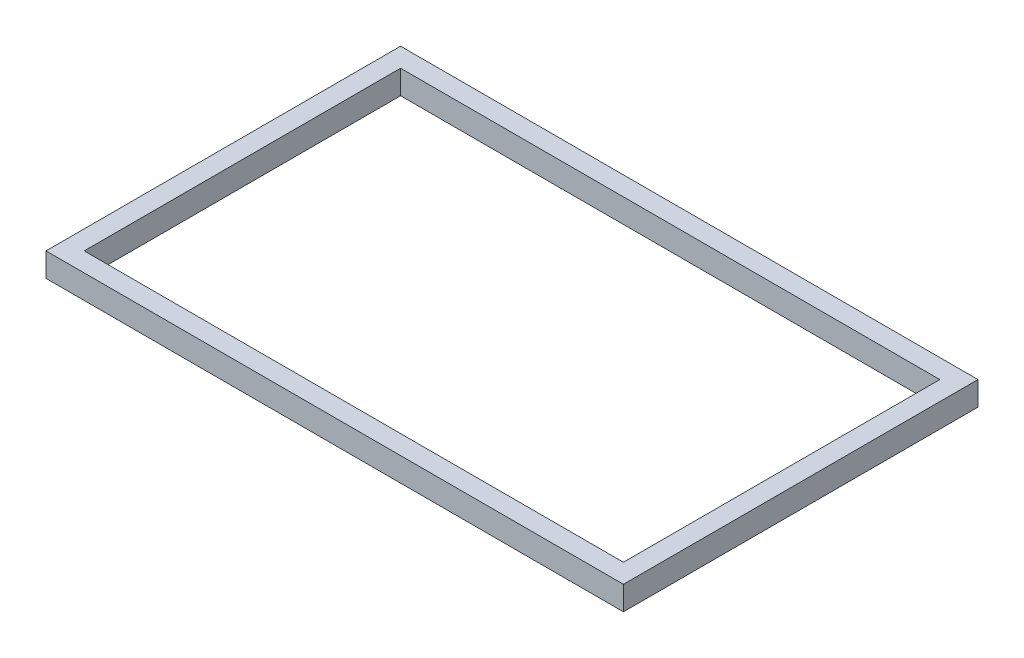
ISO-10303-21;
HEADER;
FILE_DESCRIPTION(('STEP AP214'),'2;1');
FILE_NAME('part.step','',(''),(''),'','','');
FILE_SCHEMA(('AUTOMOTIVE_DESIGN { 1 0 10303 214 1 1 1 1 }'));
ENDSEC;
DATA;
#1=APPLICATION_CONTEXT('core data for automotive mechanical design processes');
#2=APPLICATION_PROTOCOL_DEFINITION('international standard','automotive_design',2000,#1);
#3=PRODUCT_CONTEXT('',#1,'mechanical');
#4=PRODUCT('Part','Part','',(#3));
#5=PRODUCT_RELATED_PRODUCT_CATEGORY('part','',(#4));
#6=PRODUCT_DEFINITION_FORMATION('','',#4);
#7=PRODUCT_DEFINITION_CONTEXT('part definition',#1,'design');
#8=PRODUCT_DEFINITION('design','',#6,#7);
#9=PRODUCT_DEFINITION_SHAPE('','',#8);
#10=(LENGTH_UNIT() NAMED_UNIT(*) SI_UNIT(.MILLI.,.METRE.));
#11=(NAMED_UNIT(*) PLANE_ANGLE_UNIT() SI_UNIT($,.RADIAN.));
#12=(NAMED_UNIT(*) SI_UNIT($,.STERADIAN.) SOLID_ANGLE_UNIT());
#13=UNCERTAINTY_MEASURE_WITH_UNIT(LENGTH_MEASURE(1.E-05),#10,'distance_accuracy_value','');
#14=(GEOMETRIC_REPRESENTATION_CONTEXT(3) GLOBAL_UNCERTAINTY_ASSIGNED_CONTEXT((#13)) GLOBAL_UNIT_ASSIGNED_CONTEXT((#10,
#11,#12)) REPRESENTATION_CONTEXT('',''));
#15=CARTESIAN_POINT('',(0.,0.,0.));
#16=DIRECTION('',(0.,0.,1.));
#17=DIRECTION('',(1.,0.,0.));
#18=AXIS2_PLACEMENT_3D('',#15,#16,#17);
#19=CARTESIAN_POINT('',(-21.7906654675505,10.,45.635438217786));
#20=DIRECTION('',(0.,0.,1.));
#21=DIRECTION('',(1.,0.,0.));
#22=AXIS2_PLACEMENT_3D('',#19,#20,#21);
#23=PLANE('',#22);
#24=DIRECTION('',(-1.,0.,0.));
#25=VECTOR('',#24,1.);
#26=CARTESIAN_POINT('',(-21.7906654675505,2.5,45.635438217786));
#27=LINE('',#26,#25);
#28=CARTESIAN_POINT('',(34.7093345324495,2.5,45.635438217786));
#29=VERTEX_POINT('',#28);
#30=CARTESIAN_POINT('',(-21.7906654675505,2.5,45.635438217786));
#31=VERTEX_POINT('',#30);
#32=EDGE_CURVE('E143',#29,#31,#27,.T.);
#33=ORIENTED_EDGE('',*,*,#32,.F.);
#34=DIRECTION('',(0.,-1.,0.));
#35=VECTOR('',#34,1.);
#36=CARTESIAN_POINT('',(34.7093345324495,10.,45.635438217786));
#37=LINE('',#36,#35);
#38=CARTESIAN_POINT('',(34.7093345324495,0.,45.635438217786));
#39=VERTEX_POINT('',#38);
#40=EDGE_CURVE('E160',#29,#39,#37,.T.);
#41=ORIENTED_EDGE('',*,*,#40,.T.);
#42=DIRECTION('',(-1.,0.,0.));
#43=VECTOR('',#42,1.);
#44=CARTESIAN_POINT('',(-21.7906654675505,0.,45.635438217786));
#45=LINE('',#44,#43);
#46=CARTESIAN_POINT('',(-21.7906654675505,0.,45.635438217786));
#47=VERTEX_POINT('',#46);
#48=EDGE_CURVE('E155',#39,#47,#45,.T.);
#49=ORIENTED_EDGE('',*,*,#48,.T.);
#50=DIRECTION('',(0.,-1.,0.));
#51=VECTOR('',#50,1.);
#52=CARTESIAN_POINT('',(-21.7906654675505,10.,45.635438217786));
#53=LINE('',#52,#51);
#54=EDGE_CURVE('E48',#31,#47,#53,.T.);
#55=ORIENTED_EDGE('',*,*,#54,.F.);
#56=EDGE_LOOP('',(#33,#41,#49,#55));
#57=FACE_BOUND('',#56,.T.);
#58=ADVANCED_FACE('F40',(#57),#23,.F.);
#59=CARTESIAN_POINT('',(34.7093345324495,10.,45.635438217786));
#60=DIRECTION('',(1.,0.,0.));
#61=DIRECTION('',(0.,0.,-1.));
#62=AXIS2_PLACEMENT_3D('',#59,#60,#61);
#63=PLANE('',#62);
#64=DIRECTION('',(0.,0.,1.));
#65=VECTOR('',#64,1.);
#66=CARTESIAN_POINT('',(34.7093345324495,2.5,45.635438217786));
#67=LINE('',#66,#65);
#68=CARTESIAN_POINT('',(34.7093345324495,2.5,12.485438217786));
#69=VERTEX_POINT('',#68);
#70=EDGE_CURVE('E141',#69,#29,#67,.T.);
#71=ORIENTED_EDGE('',*,*,#70,.F.);
#72=DIRECTION('',(0.,-1.,0.));
#73=VECTOR('',#72,1.);
#74=CARTESIAN_POINT('',(34.7093345324495,10.,12.485438217786));
#75=LINE('',#74,#73);
#76=CARTESIAN_POINT('',(34.7093345324495,0.,12.485438217786));
#77=VERTEX_POINT('',#76);
#78=EDGE_CURVE('E162',#69,#77,#75,.T.);
#79=ORIENTED_EDGE('',*,*,#78,.T.);
#80=DIRECTION('',(0.,0.,1.));
#81=VECTOR('',#80,1.);
#82=CARTESIAN_POINT('',(34.7093345324495,0.,45.635438217786));
#83=LINE('',#82,#81);
#84=EDGE_CURVE('E152',#77,#39,#83,.T.);
#85=ORIENTED_EDGE('',*,*,#84,.T.);
#86=ORIENTED_EDGE('',*,*,#40,.F.);
#87=EDGE_LOOP('',(#71,#79,#85,#86));
#88=FACE_BOUND('',#87,.T.);
#89=ADVANCED_FACE('F178',(#88),#63,.F.);
#90=CARTESIAN_POINT('',(-21.7906654675505,10.,12.485438217786));
#91=DIRECTION('',(0.,0.,-1.));
#92=DIRECTION('',(-1.,0.,0.));
#93=AXIS2_PLACEMENT_3D('',#90,#91,#92);
#94=PLANE('',#93);
#95=DIRECTION('',(1.,0.,0.));
#96=VECTOR('',#95,1.);
#97=CARTESIAN_POINT('',(-21.7906654675505,2.5,12.485438217786));
#98=LINE('',#97,#96);
#99=CARTESIAN_POINT('',(-21.7906654675505,2.5,12.485438217786));
#100=VERTEX_POINT('',#99);
#101=EDGE_CURVE('E12',#100,#69,#98,.T.);
#102=ORIENTED_EDGE('',*,*,#101,.F.);
#103=DIRECTION('',(0.,-1.,0.));
#104=VECTOR('',#103,1.);
#105=CARTESIAN_POINT('',(-21.7906654675505,10.,12.485438217786));
#106=LINE('',#105,#104);
#107=CARTESIAN_POINT('',(-21.7906654675505,0.,12.485438217786));
#108=VERTEX_POINT('',#107);
#109=EDGE_CURVE('E158',#100,#108,#106,.T.);
#110=ORIENTED_EDGE('',*,*,#109,.T.);
#111=DIRECTION('',(1.,0.,0.));
#112=VECTOR('',#111,1.);
#113=CARTESIAN_POINT('',(-21.7906654675505,0.,12.485438217786));
#114=LINE('',#113,#112);
#115=EDGE_CURVE('E149',#108,#77,#114,.T.);
#116=ORIENTED_EDGE('',*,*,#115,.T.);
#117=ORIENTED_EDGE('',*,*,#78,.F.);
#118=EDGE_LOOP('',(#102,#110,#116,#117));
#119=FACE_BOUND('',#118,.T.);
#120=ADVANCED_FACE('F165',(#119),#94,.F.);
#121=CARTESIAN_POINT('',(40.,0.,-12.5));
#122=DIRECTION('',(0.,1.,0.));
#123=DIRECTION('',(0.,0.,1.));
#124=AXIS2_PLACEMENT_3D('',#121,#122,#123);
#125=PLANE('',#124);
#126=ORIENTED_EDGE('',*,*,#115,.F.);
#127=DIRECTION('',(0.,0.,-1.));
#128=VECTOR('',#127,1.);
#129=CARTESIAN_POINT('',(-21.7906654675505,0.,45.635438217786));
#130=LINE('',#129,#128);
#131=EDGE_CURVE('E146',#47,#108,#130,.T.);
#132=ORIENTED_EDGE('',*,*,#131,.F.);
#133=ORIENTED_EDGE('',*,*,#48,.F.);
#134=ORIENTED_EDGE('',*,*,#84,.F.);
#135=EDGE_LOOP('',(#126,#132,#133,#134));
#136=FACE_BOUND('',#135,.T.);
#137=DIRECTION('',(0.,0.,1.));
#138=VECTOR('',#137,1.);
#139=CARTESIAN_POINT('',(-23.7906654675505,0.,-12.5));
#140=LINE('',#139,#138);
#141=CARTESIAN_POINT('',(-23.7906654675505,0.,10.485438217786));
#142=VERTEX_POINT('',#141);
#143=CARTESIAN_POINT('',(-23.7906654675505,0.,47.635438217786));
#144=VERTEX_POINT('',#143);
#145=EDGE_CURVE('E115',#142,#144,#140,.T.);
#146=ORIENTED_EDGE('',*,*,#145,.F.);
#147=DIRECTION('',(-1.,0.,0.));
#148=VECTOR('',#147,1.);
#149=CARTESIAN_POINT('',(40.,0.,10.485438217786));
#150=LINE('',#149,#148);
#151=CARTESIAN_POINT('',(36.7093345324495,0.,10.485438217786));
#152=VERTEX_POINT('',#151);
#153=EDGE_CURVE('E121',#152,#142,#150,.T.);
#154=ORIENTED_EDGE('',*,*,#153,.F.);
#155=DIRECTION('',(0.,0.,-1.));
#156=VECTOR('',#155,1.);
#157=CARTESIAN_POINT('',(36.7093345324495,0.,-12.5));
#158=LINE('',#157,#156);
#159=CARTESIAN_POINT('',(36.7093345324495,0.,47.635438217786));
#160=VERTEX_POINT('',#159);
#161=EDGE_CURVE('E105',#160,#152,#158,.T.);
#162=ORIENTED_EDGE('',*,*,#161,.F.);
#163=DIRECTION('',(1.,0.,0.));
#164=VECTOR('',#163,1.);
#165=CARTESIAN_POINT('',(40.,0.,47.635438217786));
#166=LINE('',#165,#164);
#167=EDGE_CURVE('E128',#144,#160,#166,.T.);
#168=ORIENTED_EDGE('',*,*,#167,.F.);
#169=EDGE_LOOP('',(#146,#154,#162,#168));
#170=FACE_BOUND('',#169,.T.);
#171=ADVANCED_FACE('F42',(#136,#170),#125,.F.);
#172=CARTESIAN_POINT('',(-21.7906654675505,10.,45.635438217786));
#173=DIRECTION('',(-1.,0.,0.));
#174=DIRECTION('',(0.,0.,1.));
#175=AXIS2_PLACEMENT_3D('',#172,#173,#174);
#176=PLANE('',#175);
#177=DIRECTION('',(0.,0.,-1.));
#178=VECTOR('',#177,1.);
#179=CARTESIAN_POINT('',(-21.7906654675505,2.5,45.635438217786));
#180=LINE('',#179,#178);
#181=EDGE_CURVE('E62',#31,#100,#180,.T.);
#182=ORIENTED_EDGE('',*,*,#181,.F.);
#183=ORIENTED_EDGE('',*,*,#54,.T.);
#184=ORIENTED_EDGE('',*,*,#131,.T.);
#185=ORIENTED_EDGE('',*,*,#109,.F.);
#186=EDGE_LOOP('',(#182,#183,#184,#185));
#187=FACE_BOUND('',#186,.T.);
#188=ADVANCED_FACE('F171',(#187),#176,.F.);
#189=CARTESIAN_POINT('',(0.,2.5,0.));
#190=DIRECTION('',(0.,1.,0.));
#191=DIRECTION('',(0.,0.,1.));
#192=AXIS2_PLACEMENT_3D('',#189,#190,#191);
#193=PLANE('',#192);
#194=DIRECTION('',(0.,0.,1.));
#195=VECTOR('',#194,1.);
#196=CARTESIAN_POINT('',(-23.7906654675505,2.5,10.485438217786));
#197=LINE('',#196,#195);
#198=CARTESIAN_POINT('',(-23.7906654675505,2.5,10.485438217786));
#199=VERTEX_POINT('',#198);
#200=CARTESIAN_POINT('',(-23.7906654675505,2.5,47.635438217786));
#201=VERTEX_POINT('',#200);
#202=EDGE_CURVE('E127',#199,#201,#197,.T.);
#203=ORIENTED_EDGE('',*,*,#202,.T.);
#204=DIRECTION('',(1.,0.,0.));
#205=VECTOR('',#204,1.);
#206=CARTESIAN_POINT('',(-23.7906654675505,2.5,47.635438217786));
#207=LINE('',#206,#205);
#208=CARTESIAN_POINT('',(36.7093345324495,2.5,47.635438217786));
#209=VERTEX_POINT('',#208);
#210=EDGE_CURVE('E131',#201,#209,#207,.T.);
#211=ORIENTED_EDGE('',*,*,#210,.T.);
#212=DIRECTION('',(0.,0.,-1.));
#213=VECTOR('',#212,1.);
#214=CARTESIAN_POINT('',(36.7093345324495,2.5,10.485438217786));
#215=LINE('',#214,#213);
#216=CARTESIAN_POINT('',(36.7093345324495,2.5,10.485438217786));
#217=VERTEX_POINT('',#216);
#218=EDGE_CURVE('E138',#209,#217,#215,.T.);
#219=ORIENTED_EDGE('',*,*,#218,.T.);
#220=DIRECTION('',(-1.,0.,0.));
#221=VECTOR('',#220,1.);
#222=CARTESIAN_POINT('',(-23.7906654675505,2.5,10.485438217786));
#223=LINE('',#222,#221);
#224=EDGE_CURVE('E124',#217,#199,#223,.T.);
#225=ORIENTED_EDGE('',*,*,#224,.T.);
#226=EDGE_LOOP('',(#203,#211,#219,#225));
#227=FACE_BOUND('',#226,.T.);
#228=ORIENTED_EDGE('',*,*,#181,.T.);
#229=ORIENTED_EDGE('',*,*,#101,.T.);
#230=ORIENTED_EDGE('',*,*,#70,.T.);
#231=ORIENTED_EDGE('',*,*,#32,.T.);
#232=EDGE_LOOP('',(#228,#229,#230,#231));
#233=FACE_BOUND('',#232,.T.);
#234=ADVANCED_FACE('F180',(#227,#233),#193,.T.);
#235=CARTESIAN_POINT('',(-23.7906654675505,-2.,10.485438217786));
#236=DIRECTION('',(0.,0.,-1.));
#237=DIRECTION('',(-1.,0.,0.));
#238=AXIS2_PLACEMENT_3D('',#235,#236,#237);
#239=PLANE('',#238);
#240=ORIENTED_EDGE('',*,*,#153,.T.);
#241=DIRECTION('',(0.,1.,0.));
#242=VECTOR('',#241,1.);
#243=CARTESIAN_POINT('',(-23.7906654675505,-2.,10.485438217786));
#244=LINE('',#243,#242);
#245=EDGE_CURVE('E116',#142,#199,#244,.T.);
#246=ORIENTED_EDGE('',*,*,#245,.T.);
#247=ORIENTED_EDGE('',*,*,#224,.F.);
#248=DIRECTION('',(0.,1.,0.));
#249=VECTOR('',#248,1.);
#250=CARTESIAN_POINT('',(36.7093345324495,-2.,10.485438217786));
#251=LINE('',#250,#249);
#252=EDGE_CURVE('E109',#152,#217,#251,.T.);
#253=ORIENTED_EDGE('',*,*,#252,.F.);
#254=EDGE_LOOP('',(#240,#246,#247,#253));
#255=FACE_BOUND('',#254,.T.);
#256=ADVANCED_FACE('F119',(#255),#239,.T.);
#257=CARTESIAN_POINT('',(-23.7906654675505,-2.,47.635438217786));
#258=DIRECTION('',(0.,0.,1.));
#259=DIRECTION('',(1.,0.,0.));
#260=AXIS2_PLACEMENT_3D('',#257,#258,#259);
#261=PLANE('',#260);
#262=ORIENTED_EDGE('',*,*,#167,.T.);
#263=DIRECTION('',(0.,1.,0.));
#264=VECTOR('',#263,1.);
#265=CARTESIAN_POINT('',(36.7093345324495,-2.,47.635438217786));
#266=LINE('',#265,#264);
#267=EDGE_CURVE('E111',#160,#209,#266,.T.);
#268=ORIENTED_EDGE('',*,*,#267,.T.);
#269=ORIENTED_EDGE('',*,*,#210,.F.);
#270=DIRECTION('',(0.,1.,0.));
#271=VECTOR('',#270,1.);
#272=CARTESIAN_POINT('',(-23.7906654675505,-2.,47.635438217786));
#273=LINE('',#272,#271);
#274=EDGE_CURVE('E55',#144,#201,#273,.T.);
#275=ORIENTED_EDGE('',*,*,#274,.F.);
#276=EDGE_LOOP('',(#262,#268,#269,#275));
#277=FACE_BOUND('',#276,.T.);
#278=ADVANCED_FACE('F218',(#277),#261,.T.);
#279=CARTESIAN_POINT('',(-23.7906654675505,-2.,10.485438217786));
#280=DIRECTION('',(-1.,0.,0.));
#281=DIRECTION('',(0.,0.,1.));
#282=AXIS2_PLACEMENT_3D('',#279,#280,#281);
#283=PLANE('',#282);
#284=ORIENTED_EDGE('',*,*,#145,.T.);
#285=ORIENTED_EDGE('',*,*,#274,.T.);
#286=ORIENTED_EDGE('',*,*,#202,.F.);
#287=ORIENTED_EDGE('',*,*,#245,.F.);
#288=EDGE_LOOP('',(#284,#285,#286,#287));
#289=FACE_BOUND('',#288,.T.);
#290=ADVANCED_FACE('F227',(#289),#283,.T.);
#291=CARTESIAN_POINT('',(36.7093345324495,-2.,10.485438217786));
#292=DIRECTION('',(1.,0.,0.));
#293=DIRECTION('',(0.,0.,-1.));
#294=AXIS2_PLACEMENT_3D('',#291,#292,#293);
#295=PLANE('',#294);
#296=ORIENTED_EDGE('',*,*,#161,.T.);
#297=ORIENTED_EDGE('',*,*,#252,.T.);
#298=ORIENTED_EDGE('',*,*,#218,.F.);
#299=ORIENTED_EDGE('',*,*,#267,.F.);
#300=EDGE_LOOP('',(#296,#297,#298,#299));
#301=FACE_BOUND('',#300,.T.);
#302=ADVANCED_FACE('F107',(#301),#295,.T.);
#303=CLOSED_SHELL('',(#58,#89,#120,#171,#188,#234,#256,#278,#290,#302));
#304=MANIFOLD_SOLID_BREP('B2',#303);
#305=ADVANCED_BREP_SHAPE_REPRESENTATION('',(#18,#304),#14);
#306=SHAPE_DEFINITION_REPRESENTATION(#9,#305);
ENDSEC;
END-ISO-10303-21;
